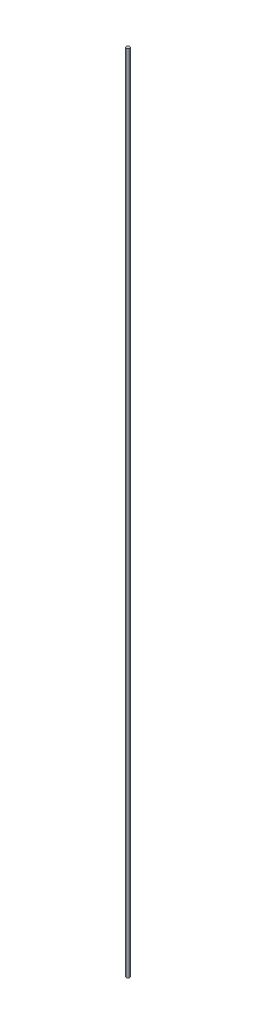
ISO-10303-21;
HEADER;
FILE_DESCRIPTION(('STEP AP214'),'2;1');
FILE_NAME('part.step','',(''),(''),'','','');
FILE_SCHEMA(('AUTOMOTIVE_DESIGN { 1 0 10303 214 1 1 1 1 }'));
ENDSEC;
DATA;
#1=APPLICATION_CONTEXT('core data for automotive mechanical design processes');
#2=APPLICATION_PROTOCOL_DEFINITION('international standard','automotive_design',2000,#1);
#3=PRODUCT_CONTEXT('',#1,'mechanical');
#4=PRODUCT('Part','Part','',(#3));
#5=PRODUCT_RELATED_PRODUCT_CATEGORY('part','',(#4));
#6=PRODUCT_DEFINITION_FORMATION('','',#4);
#7=PRODUCT_DEFINITION_CONTEXT('part definition',#1,'design');
#8=PRODUCT_DEFINITION('design','',#6,#7);
#9=PRODUCT_DEFINITION_SHAPE('','',#8);
#10=(LENGTH_UNIT() NAMED_UNIT(*) SI_UNIT(.MILLI.,.METRE.));
#11=(NAMED_UNIT(*) PLANE_ANGLE_UNIT() SI_UNIT($,.RADIAN.));
#12=(NAMED_UNIT(*) SI_UNIT($,.STERADIAN.) SOLID_ANGLE_UNIT());
#13=UNCERTAINTY_MEASURE_WITH_UNIT(LENGTH_MEASURE(1.E-05),#10,'distance_accuracy_value','');
#14=(GEOMETRIC_REPRESENTATION_CONTEXT(3) GLOBAL_UNCERTAINTY_ASSIGNED_CONTEXT((#13)) GLOBAL_UNIT_ASSIGNED_CONTEXT((#10,
#11,#12)) REPRESENTATION_CONTEXT('',''));
#15=CARTESIAN_POINT('',(0.,0.,0.));
#16=DIRECTION('',(0.,0.,1.));
#17=DIRECTION('',(1.,0.,0.));
#18=AXIS2_PLACEMENT_3D('',#15,#16,#17);
#19=CARTESIAN_POINT('',(0.,1250.,0.));
#20=DIRECTION('',(0.,-1.,0.));
#21=DIRECTION('',(0.,0.,-1.));
#22=AXIS2_PLACEMENT_3D('',#19,#20,#21);
#23=CYLINDRICAL_SURFACE('',#22,2.5);
#24=CARTESIAN_POINT('',(0.,1250.,0.));
#25=DIRECTION('',(0.,1.,0.));
#26=DIRECTION('',(0.,0.,1.));
#27=AXIS2_PLACEMENT_3D('',#24,#25,#26);
#28=CIRCLE('',#27,2.5);
#29=CARTESIAN_POINT('',(0.,1250.,2.5));
#30=VERTEX_POINT('',#29);
#31=EDGE_CURVE('E10',#30,#30,#28,.T.);
#32=ORIENTED_EDGE('',*,*,#31,.F.);
#33=EDGE_LOOP('',(#32));
#34=FACE_BOUND('',#33,.T.);
#35=CARTESIAN_POINT('',(0.,0.,0.));
#36=DIRECTION('',(0.,1.,0.));
#37=DIRECTION('',(0.,0.,1.));
#38=AXIS2_PLACEMENT_3D('',#35,#36,#37);
#39=CIRCLE('',#38,2.5);
#40=CARTESIAN_POINT('',(0.,0.,2.5));
#41=VERTEX_POINT('',#40);
#42=EDGE_CURVE('E34',#41,#41,#39,.T.);
#43=ORIENTED_EDGE('',*,*,#42,.T.);
#44=EDGE_LOOP('',(#43));
#45=FACE_BOUND('',#44,.T.);
#46=ADVANCED_FACE('F31',(#34,#45),#23,.T.);
#47=CARTESIAN_POINT('',(0.,1250.,0.));
#48=DIRECTION('',(0.,1.,0.));
#49=DIRECTION('',(0.,0.,1.));
#50=AXIS2_PLACEMENT_3D('',#47,#48,#49);
#51=PLANE('',#50);
#52=ORIENTED_EDGE('',*,*,#31,.T.);
#53=EDGE_LOOP('',(#52));
#54=FACE_BOUND('',#53,.T.);
#55=ADVANCED_FACE('F46',(#54),#51,.T.);
#56=CARTESIAN_POINT('',(0.,0.,0.));
#57=DIRECTION('',(0.,1.,0.));
#58=DIRECTION('',(0.,0.,1.));
#59=AXIS2_PLACEMENT_3D('',#56,#57,#58);
#60=PLANE('',#59);
#61=ORIENTED_EDGE('',*,*,#42,.F.);
#62=EDGE_LOOP('',(#61));
#63=FACE_BOUND('',#62,.T.);
#64=ADVANCED_FACE('F44',(#63),#60,.F.);
#65=CLOSED_SHELL('',(#46,#55,#64));
#66=MANIFOLD_SOLID_BREP('B2',#65);
#67=ADVANCED_BREP_SHAPE_REPRESENTATION('',(#18,#66),#14);
#68=SHAPE_DEFINITION_REPRESENTATION(#9,#67);
ENDSEC;
END-ISO-10303-21;
